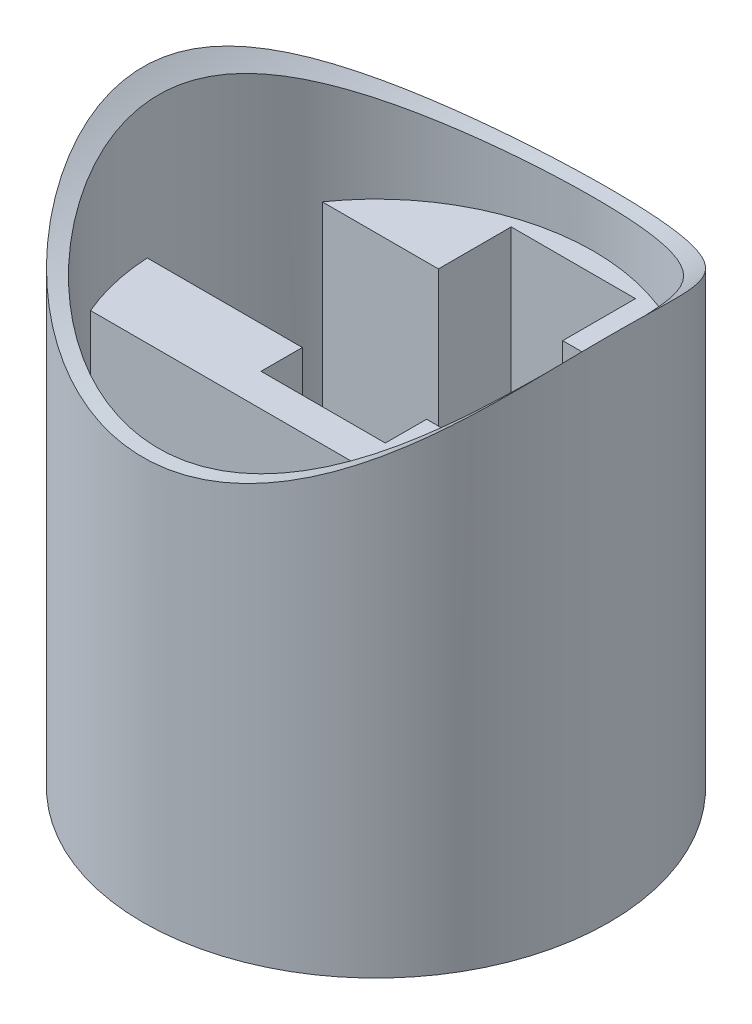
ISO-10303-21;
HEADER;
FILE_DESCRIPTION(('STEP AP214'),'2;1');
FILE_NAME('part.step','',(''),(''),'','','');
FILE_SCHEMA(('AUTOMOTIVE_DESIGN { 1 0 10303 214 1 1 1 1 }'));
ENDSEC;
DATA;
#1=APPLICATION_CONTEXT('core data for automotive mechanical design processes');
#2=APPLICATION_PROTOCOL_DEFINITION('international standard','automotive_design',2000,#1);
#3=PRODUCT_CONTEXT('',#1,'mechanical');
#4=PRODUCT('Part','Part','',(#3));
#5=PRODUCT_RELATED_PRODUCT_CATEGORY('part','',(#4));
#6=PRODUCT_DEFINITION_FORMATION('','',#4);
#7=PRODUCT_DEFINITION_CONTEXT('part definition',#1,'design');
#8=PRODUCT_DEFINITION('design','',#6,#7);
#9=PRODUCT_DEFINITION_SHAPE('','',#8);
#10=(LENGTH_UNIT() NAMED_UNIT(*) SI_UNIT(.MILLI.,.METRE.));
#11=(NAMED_UNIT(*) PLANE_ANGLE_UNIT() SI_UNIT($,.RADIAN.));
#12=(NAMED_UNIT(*) SI_UNIT($,.STERADIAN.) SOLID_ANGLE_UNIT());
#13=UNCERTAINTY_MEASURE_WITH_UNIT(LENGTH_MEASURE(1.E-05),#10,'distance_accuracy_value','');
#14=(GEOMETRIC_REPRESENTATION_CONTEXT(3) GLOBAL_UNCERTAINTY_ASSIGNED_CONTEXT((#13)) GLOBAL_UNIT_ASSIGNED_CONTEXT((#10,
#11,#12)) REPRESENTATION_CONTEXT('',''));
#15=CARTESIAN_POINT('',(0.,0.,0.));
#16=DIRECTION('',(0.,0.,1.));
#17=DIRECTION('',(1.,0.,0.));
#18=AXIS2_PLACEMENT_3D('',#15,#16,#17);
#19=CARTESIAN_POINT('',(0.,37.3,0.));
#20=DIRECTION('',(0.,-1.,0.));
#21=DIRECTION('',(0.,0.,-1.));
#22=AXIS2_PLACEMENT_3D('',#19,#20,#21);
#23=CYLINDRICAL_SURFACE('',#22,35.);
#24=CARTESIAN_POINT('',(0.,0.,0.));
#25=DIRECTION('',(0.,1.,0.));
#26=DIRECTION('',(0.,0.,1.));
#27=AXIS2_PLACEMENT_3D('',#24,#25,#26);
#28=CIRCLE('',#27,35.);
#29=CARTESIAN_POINT('',(-32.185295709608,0.,13.7516086362682));
#30=VERTEX_POINT('',#29);
#31=CARTESIAN_POINT('',(32.185295709608,0.,13.7516086362682));
#32=VERTEX_POINT('',#31);
#33=EDGE_CURVE('E147',#30,#32,#28,.T.);
#34=ORIENTED_EDGE('',*,*,#33,.F.);
#35=DIRECTION('',(0.,-1.,0.));
#36=VECTOR('',#35,1.);
#37=CARTESIAN_POINT('',(-32.185295709608,37.3,13.7516086362682));
#38=LINE('',#37,#36);
#39=CARTESIAN_POINT('',(-32.185295709608,37.3,13.7516086362682));
#40=VERTEX_POINT('',#39);
#41=EDGE_CURVE('E176',#40,#30,#38,.T.);
#42=ORIENTED_EDGE('',*,*,#41,.F.);
#43=CARTESIAN_POINT('',(0.,37.3,0.));
#44=DIRECTION('',(0.,1.,0.));
#45=DIRECTION('',(0.,0.,1.));
#46=AXIS2_PLACEMENT_3D('',#43,#44,#45);
#47=CIRCLE('',#46,35.);
#48=CARTESIAN_POINT('',(-34.9504647747409,37.3,1.86145427813728));
#49=VERTEX_POINT('',#48);
#50=EDGE_CURVE('E53',#49,#40,#47,.T.);
#51=ORIENTED_EDGE('',*,*,#50,.F.);
#52=DIRECTION('',(0.,-1.,0.));
#53=VECTOR('',#52,1.);
#54=CARTESIAN_POINT('',(-34.9504647747409,37.3,1.86145427813728));
#55=LINE('',#54,#53);
#56=CARTESIAN_POINT('',(-34.9504647747409,0.,1.86145427813728));
#57=VERTEX_POINT('',#56);
#58=EDGE_CURVE('E189',#49,#57,#55,.T.);
#59=ORIENTED_EDGE('',*,*,#58,.T.);
#60=CARTESIAN_POINT('',(-28.6937358472909,0.,-20.04169461712));
#61=VERTEX_POINT('',#60);
#62=EDGE_CURVE('E148',#61,#57,#28,.T.);
#63=ORIENTED_EDGE('',*,*,#62,.F.);
#64=DIRECTION('',(0.,-1.,0.));
#65=VECTOR('',#64,1.);
#66=CARTESIAN_POINT('',(-28.6937358472909,37.3,-20.04169461712));
#67=LINE('',#66,#65);
#68=CARTESIAN_POINT('',(-28.6937358472909,37.3,-20.04169461712));
#69=VERTEX_POINT('',#68);
#70=EDGE_CURVE('E186',#69,#61,#67,.T.);
#71=ORIENTED_EDGE('',*,*,#70,.F.);
#72=CARTESIAN_POINT('',(28.6937358472909,37.3,-20.04169461712));
#73=VERTEX_POINT('',#72);
#74=EDGE_CURVE('E11',#73,#69,#47,.T.);
#75=ORIENTED_EDGE('',*,*,#74,.F.);
#76=DIRECTION('',(0.,-1.,0.));
#77=VECTOR('',#76,1.);
#78=CARTESIAN_POINT('',(28.6937358472909,37.3,-20.04169461712));
#79=LINE('',#78,#77);
#80=CARTESIAN_POINT('',(28.6937358472909,0.,-20.04169461712));
#81=VERTEX_POINT('',#80);
#82=EDGE_CURVE('E143',#73,#81,#79,.T.);
#83=ORIENTED_EDGE('',*,*,#82,.T.);
#84=CARTESIAN_POINT('',(34.9504647747409,0.,1.86145427813728));
#85=VERTEX_POINT('',#84);
#86=EDGE_CURVE('E84',#85,#81,#28,.T.);
#87=ORIENTED_EDGE('',*,*,#86,.F.);
#88=DIRECTION('',(0.,-1.,0.));
#89=VECTOR('',#88,1.);
#90=CARTESIAN_POINT('',(34.9504647747409,37.3,1.86145427813728));
#91=LINE('',#90,#89);
#92=CARTESIAN_POINT('',(34.9504647747409,37.3,1.86145427813728));
#93=VERTEX_POINT('',#92);
#94=EDGE_CURVE('E177',#93,#85,#91,.T.);
#95=ORIENTED_EDGE('',*,*,#94,.F.);
#96=CARTESIAN_POINT('',(32.185295709608,37.3,13.7516086362682));
#97=VERTEX_POINT('',#96);
#98=EDGE_CURVE('E55',#97,#93,#47,.T.);
#99=ORIENTED_EDGE('',*,*,#98,.F.);
#100=DIRECTION('',(0.,-1.,0.));
#101=VECTOR('',#100,1.);
#102=CARTESIAN_POINT('',(32.185295709608,37.3,13.7516086362682));
#103=LINE('',#102,#101);
#104=EDGE_CURVE('E174',#97,#32,#103,.T.);
#105=ORIENTED_EDGE('',*,*,#104,.T.);
#106=EDGE_LOOP('',(#34,#42,#51,#59,#63,#71,#75,#83,#87,#95,#99,#105));
#107=FACE_BOUND('',#106,.T.);
#108=CARTESIAN_POINT('',(0.,44.8,-35.));
#109=CARTESIAN_POINT('',(-0.870232272500166,44.7999953172574,-35.0000050028505));
#110=CARTESIAN_POINT('',(-1.7404063049654,44.8227637162921,-34.9675030057698));
#111=CARTESIAN_POINT('',(-3.47352174425243,44.9132540161992,-34.8380480222201));
#112=CARTESIAN_POINT('',(-4.33646377261778,44.9809720129823,-34.741100633143));
#113=CARTESIAN_POINT('',(-6.04853863287652,45.15973116088,-34.4842684531884));
#114=CARTESIAN_POINT('',(-6.89766808169942,45.2707827639554,-34.3243684782164));
#115=CARTESIAN_POINT('',(-8.57578993154747,45.5336095547233,-33.9440143729934));
#116=CARTESIAN_POINT('',(-9.4047816345072,45.6853861519379,-33.7235581468396));
#117=CARTESIAN_POINT('',(-11.0332645970626,46.0254608125883,-33.2263207402555));
#118=CARTESIAN_POINT('',(-11.8328814909331,46.2135745196777,-32.949823548786));
#119=CARTESIAN_POINT('',(-13.4026192119663,46.6229535279744,-32.3431278646174));
#120=CARTESIAN_POINT('',(-14.1727403348015,46.8442184967565,-32.0129299104013));
#121=CARTESIAN_POINT('',(-15.6801115653812,47.315710078695,-31.3022123034325));
#122=CARTESIAN_POINT('',(-16.4173617516748,47.5659366226391,-30.9216927709379));
#123=CARTESIAN_POINT('',(-17.8564301108427,48.0909572365887,-30.1136018656613));
#124=CARTESIAN_POINT('',(-18.5582465238746,48.3657525249431,-29.6860281592486));
#125=CARTESIAN_POINT('',(-19.9848211152601,48.9605448495063,-28.7471572150268));
#126=CARTESIAN_POINT('',(-20.7061360797619,49.2823907504658,-28.2318011800753));
#127=CARTESIAN_POINT('',(-22.102634778417,49.9438899633164,-27.1523945586661));
#128=CARTESIAN_POINT('',(-22.7778163247959,50.2835441183761,-26.5883416657359));
#129=CARTESIAN_POINT('',(-24.0815274047952,50.9750618121491,-25.4135997093617));
#130=CARTESIAN_POINT('',(-24.7099908945907,51.3269416408213,-24.8028470108141));
#131=CARTESIAN_POINT('',(-25.917999123033,52.0361368766176,-23.5376807768098));
#132=CARTESIAN_POINT('',(-26.4975410370482,52.3934525961951,-22.883264724221));
#133=CARTESIAN_POINT('',(-27.7041565227637,53.1697139443232,-21.4134589202318));
#134=CARTESIAN_POINT('',(-28.3216161660374,53.5884269024707,-20.5900212446242));
#135=CARTESIAN_POINT('',(-29.4846248574707,54.4123175922997,-18.8870417012328));
#136=CARTESIAN_POINT('',(-30.030155249065,54.8174917921164,-18.0074853651762));
#137=CARTESIAN_POINT('',(-31.0449435416097,55.6002355170416,-16.1953260591599));
#138=CARTESIAN_POINT('',(-31.5142997158184,55.9778402580138,-15.2627935665584));
#139=CARTESIAN_POINT('',(-32.3725792269623,56.6905882066562,-13.3460634545392));
#140=CARTESIAN_POINT('',(-32.7615449259486,57.025753741565,-12.3618933903296));
#141=CARTESIAN_POINT('',(-33.3451470680861,57.5414149359981,-10.6601711031505));
#142=CARTESIAN_POINT('',(-33.5625682245631,57.7375609159975,-9.95511151138583));
#143=CARTESIAN_POINT('',(-33.9540987355543,58.0959176628177,-8.52459851568257));
#144=CARTESIAN_POINT('',(-34.1282150838378,58.2581339086503,-7.79914842592035));
#145=CARTESIAN_POINT('',(-34.4305317720713,58.5428397985108,-6.33231404014387));
#146=CARTESIAN_POINT('',(-34.5588090309209,58.6653959600004,-5.59095867114069));
#147=CARTESIAN_POINT('',(-34.7677456086353,58.8663806541385,-4.09556918006492));
#148=CARTESIAN_POINT('',(-34.8484050344508,58.9448092858987,-3.34153508647297));
#149=CARTESIAN_POINT('',(-34.9608969493595,59.0544829109754,-1.82193032229542));
#150=CARTESIAN_POINT('',(-34.9924426024632,59.0854507055495,-1.05631805359883));
#151=CARTESIAN_POINT('',(-35.0051496272315,59.0979050016435,0.475730381078191));
#152=CARTESIAN_POINT('',(-34.9863111850584,59.0793916859893,1.24216654400399));
#153=CARTESIAN_POINT('',(-34.8986208441605,58.9937163419341,2.76984985356926));
#154=CARTESIAN_POINT('',(-34.8297390970229,58.9265252796773,3.53109362955619));
#155=CARTESIAN_POINT('',(-34.6432842435913,58.7464351025755,5.0420637772475));
#156=CARTESIAN_POINT('',(-34.5257101254215,58.6335350378534,5.79178990926803));
#157=CARTESIAN_POINT('',(-34.2532963381461,58.3754981601892,7.22553544524251));
#158=CARTESIAN_POINT('',(-34.1014533690274,58.2330031116955,7.91060977052729));
#159=CARTESIAN_POINT('',(-33.7589888057992,57.9166028261327,9.26380107661202));
#160=CARTESIAN_POINT('',(-33.5683529619254,57.7426860495786,9.93191172442692));
#161=CARTESIAN_POINT('',(-33.1501750145558,57.3681333630529,11.2491653221722));
#162=CARTESIAN_POINT('',(-32.9226130438115,57.1674830801928,11.8982978382344));
#163=CARTESIAN_POINT('',(-32.4325419821708,56.7443163101299,13.1756669761685));
#164=CARTESIAN_POINT('',(-32.1700382646967,56.5218031864199,13.8039067924386));
#165=CARTESIAN_POINT('',(-31.4634650949709,55.9366778949229,15.3663950836281));
#166=CARTESIAN_POINT('',(-30.996945831479,55.5623594887798,16.2861965724637));
#167=CARTESIAN_POINT('',(-29.990231448705,54.7876297370643,18.0731428843509));
#168=CARTESIAN_POINT('',(-29.4500062373211,54.3872077691783,18.9402659902055));
#169=CARTESIAN_POINT('',(-28.2982946846362,53.5725218843927,20.6215052468992));
#170=CARTESIAN_POINT('',(-27.6866822177674,53.1582344198714,21.4355234948486));
#171=CARTESIAN_POINT('',(-26.395557161849,52.3280842687203,23.0067017387662));
#172=CARTESIAN_POINT('',(-25.716053266374,51.9122217903174,23.7638689928764));
#173=CARTESIAN_POINT('',(-24.282503247462,51.0844038840303,25.227400571408));
#174=CARTESIAN_POINT('',(-23.5276600959749,50.6725553131809,25.9330457904297));
#175=CARTESIAN_POINT('',(-21.9523703939848,49.8681002773168,27.2794229232896));
#176=CARTESIAN_POINT('',(-21.1319177462958,49.4754956061469,27.9201487915053));
#177=CARTESIAN_POINT('',(-19.4296026042396,48.7201113400548,29.1303820613389));
#178=CARTESIAN_POINT('',(-18.5478533739427,48.3572793019831,29.7000156531339));
#179=CARTESIAN_POINT('',(-16.7254223448341,47.6703101246462,30.7631633942938));
#180=CARTESIAN_POINT('',(-15.7847582476006,47.3461614468069,31.2567002548817));
#181=CARTESIAN_POINT('',(-14.0638566010933,46.8121805002745,32.0608786010831));
#182=CARTESIAN_POINT('',(-13.294127782226,46.5929183226784,32.3878323646545));
#183=CARTESIAN_POINT('',(-11.7255644343501,46.1875846662284,32.98811888247));
#184=CARTESIAN_POINT('',(-10.9267338992557,46.001508653422,33.2614589620204));
#185=CARTESIAN_POINT('',(-9.30461607908543,45.6664103993224,33.7511702836791));
#186=CARTESIAN_POINT('',(-8.4813412531449,45.5173696323341,33.9675700115775));
#187=CARTESIAN_POINT('',(-6.81512211938829,45.2594640133613,34.3406887006037));
#188=CARTESIAN_POINT('',(-5.97217741167641,45.1505999789422,34.4974064472516));
#189=CARTESIAN_POINT('',(-4.26917518982882,44.9752088530217,34.7493603279024));
#190=CARTESIAN_POINT('',(-3.40906158295147,44.9088575977143,34.8443411361966));
#191=CARTESIAN_POINT('',(-1.68186449744328,44.8208141178331,34.9702882164267));
#192=CARTESIAN_POINT('',(-0.814781019939594,44.7991218860375,35.0012544987146));
#193=CARTESIAN_POINT('',(0.919213573146765,44.800932644772,34.9986676001079));
#194=CARTESIAN_POINT('',(1.78612469288872,44.8244343651223,34.9651162324871));
#195=CARTESIAN_POINT('',(3.51268174307029,44.9160510638679,34.8340431489635));
#196=CARTESIAN_POINT('',(4.37232793341643,44.9841644393562,34.736523731447));
#197=CARTESIAN_POINT('',(6.02181468542681,45.1574779045319,34.4874963238937));
#198=CARTESIAN_POINT('',(6.81254374887127,45.2599612538386,34.3399362019104));
#199=CARTESIAN_POINT('',(8.37678839379366,45.5003494049773,33.9922245209992));
#200=CARTESIAN_POINT('',(9.1503048800013,45.6382523402788,33.7920757333598));
#201=CARTESIAN_POINT('',(10.6758813786184,45.9468389033205,33.3415398294173));
#202=CARTESIAN_POINT('',(11.4279395926792,46.1175252693207,33.0911485164926));
#203=CARTESIAN_POINT('',(12.9069400369755,46.488590215088,32.5427880820563));
#204=CARTESIAN_POINT('',(13.6338808721898,46.6889704407961,32.244816323073));
#205=CARTESIAN_POINT('',(15.1100577321844,47.131132126945,31.5814246835964));
#206=CARTESIAN_POINT('',(15.8572430318164,47.374837980671,31.2127277125839));
#207=CARTESIAN_POINT('',(17.3166332086913,47.8880328750213,30.4273074528046));
#208=CARTESIAN_POINT('',(18.0288368025108,48.1575228605569,30.0105824038381));
#209=CARTESIAN_POINT('',(19.4164933103296,48.7178997452128,29.1320185952275));
#210=CARTESIAN_POINT('',(20.0919284960775,49.0087968097489,28.6701583679987));
#211=CARTESIAN_POINT('',(21.4041263423369,49.6072626685292,27.7042811667664));
#212=CARTESIAN_POINT('',(22.0408868977116,49.9148323685765,27.2002619015062));
#213=CARTESIAN_POINT('',(23.3800396878468,50.5955870084453,26.0628453173255));
#214=CARTESIAN_POINT('',(24.0750385491608,50.9709993214023,25.4220614956052));
#215=CARTESIAN_POINT('',(25.4087931103085,51.7304943373356,24.0890524522557));
#216=CARTESIAN_POINT('',(26.0475407061654,52.11457827963,23.3968198449338));
#217=CARTESIAN_POINT('',(27.267628446132,52.883455203745,21.9627738354058));
#218=CARTESIAN_POINT('',(27.8489237337366,53.268248504346,21.2209224387395));
#219=CARTESIAN_POINT('',(28.9516393742928,54.0292847605453,19.6899077976574));
#220=CARTESIAN_POINT('',(29.4730665085803,54.4055286806619,18.9007499271453));
#221=CARTESIAN_POINT('',(30.4067125742577,55.1044253033261,17.3541850110502));
#222=CARTESIAN_POINT('',(30.8246071200569,55.4287611045638,16.6009653168964));
#223=CARTESIAN_POINT('',(31.6071001429939,56.0541349533813,15.0578711781996));
#224=CARTESIAN_POINT('',(31.971697235848,56.355172395742,14.2679957823074));
#225=CARTESIAN_POINT('',(32.6439561302433,56.9243366447996,12.6544361680078));
#226=CARTESIAN_POINT('',(32.9517078185012,57.1925151795294,11.8308078857448));
#227=CARTESIAN_POINT('',(33.5072229275964,57.6866006983595,10.1512421641427));
#228=CARTESIAN_POINT('',(33.7550024839275,57.9125190488327,9.29531348701855));
#229=CARTESIAN_POINT('',(34.1428567677205,58.2716499483796,7.73153309223871));
#230=CARTESIAN_POINT('',(34.2945793427502,58.4143710387409,7.02874420606836));
#231=CARTESIAN_POINT('',(34.5552281784688,58.6618121539788,5.60866076307217));
#232=CARTESIAN_POINT('',(34.6641599386505,58.7665370620079,4.89136808274731));
#233=CARTESIAN_POINT('',(34.8373963630593,58.9339937365367,3.44731721016306));
#234=CARTESIAN_POINT('',(34.9017502116632,58.9967717817674,2.7205703542331));
#235=CARTESIAN_POINT('',(34.9848682116883,59.0779839637119,1.26196217526727));
#236=CARTESIAN_POINT('',(35.0036319102858,59.0964176599759,0.530100801503916));
#237=CARTESIAN_POINT('',(34.9952029943901,59.0881560514529,-0.933973005964386));
#238=CARTESIAN_POINT('',(34.9679555000256,59.0614068547386,-1.66618481603511));
#239=CARTESIAN_POINT('',(34.8679201881697,58.9638038185339,-3.12447973736782));
#240=CARTESIAN_POINT('',(34.7951326480787,58.8929502476987,-3.85056288593433));
#241=CARTESIAN_POINT('',(34.6051877008243,58.7098585900908,-5.2924965828901));
#242=CARTESIAN_POINT('',(34.4879747643385,58.5975687148525,-6.00833315673878));
#243=CARTESIAN_POINT('',(34.2110182676687,58.3357377014746,-7.42477357457712));
#244=CARTESIAN_POINT('',(34.0512690499649,58.1861916082581,-8.12537537885523));
#245=CARTESIAN_POINT('',(33.6404354364489,57.8078445470819,-9.7036406614853));
#246=CARTESIAN_POINT('',(33.376297853919,57.5685887166693,-10.5754147197585));
#247=CARTESIAN_POINT('',(32.7858092176535,57.0475757737317,-12.2844975336967));
#248=CARTESIAN_POINT('',(32.4594391994652,56.765805711074,-13.1217956884992));
#249=CARTESIAN_POINT('',(31.7479704509998,56.1699356926838,-14.7602513516134));
#250=CARTESIAN_POINT('',(31.3628028013533,55.8557979396252,-15.5613649994883));
#251=CARTESIAN_POINT('',(30.5371993348437,55.20510520001,-17.1248665902838));
#252=CARTESIAN_POINT('',(30.0967667568063,54.8685515276902,-17.8872567989337));
#253=CARTESIAN_POINT('',(29.1519412024148,54.1734520083068,-19.3899619692432));
#254=CARTESIAN_POINT('',(28.6462778984177,53.814573726319,-20.129323014711));
#255=CARTESIAN_POINT('',(27.5815143441779,53.0905934269993,-21.5652255441576));
#256=CARTESIAN_POINT('',(27.0224143598532,52.725491440646,-22.2617672411906));
#257=CARTESIAN_POINT('',(25.8521175062051,51.9964555657974,-23.6107068578307));
#258=CARTESIAN_POINT('',(25.2409057126123,51.632522043112,-24.2630920348705));
#259=CARTESIAN_POINT('',(23.9678165846028,50.9128879002986,-25.5214602870096));
#260=CARTESIAN_POINT('',(23.3059338423423,50.55718816421,-26.1274383954825));
#261=CARTESIAN_POINT('',(21.8062903640518,49.796482813713,-27.3974591605009));
#262=CARTESIAN_POINT('',(20.9585928958463,49.3944668880692,-28.0516304885995));
#263=CARTESIAN_POINT('',(19.1968024658869,48.6219962542282,-29.2854798616255));
#264=CARTESIAN_POINT('',(18.2826994982445,48.2515463207004,-29.8651466437189));
#265=CARTESIAN_POINT('',(16.3931041007643,47.5529919248331,-30.9426542203358));
#266=CARTESIAN_POINT('',(15.4176640448714,47.2248520464071,-31.4405635475673));
#267=CARTESIAN_POINT('',(13.4109161011486,46.6207069740914,-32.3474679886086));
#268=CARTESIAN_POINT('',(12.3796240931735,46.3446870605277,-32.7564882113394));
#269=CARTESIAN_POINT('',(10.4286834386278,45.8910097063735,-33.4236386751555));
#270=CARTESIAN_POINT('',(9.51560891229527,45.7047992969145,-33.6952158786324));
#271=CARTESIAN_POINT('',(7.66208842358354,45.3816142576465,-34.1643944527418));
#272=CARTESIAN_POINT('',(6.72164532429602,45.2446344975737,-34.3620035315884));
#273=CARTESIAN_POINT('',(4.82256952364146,45.0239449721178,-34.679513721252));
#274=CARTESIAN_POINT('',(3.86395723969587,44.9401786851245,-34.7994972858562));
#275=CARTESIAN_POINT('',(1.93687202737273,44.828211191236,-34.9597342169896));
#276=CARTESIAN_POINT('',(0.968399953266366,44.8000052109855,-34.9999944327965));
#277=CARTESIAN_POINT('',(0.,44.8,-35.));
#278=B_SPLINE_CURVE_WITH_KNOTS('',3,(#108,#109,#110,#111,#112,#113,#114,#115,#116,#117,#118,
#119,#120,#121,#122,#123,#124,#125,#126,#127,#128,#129,#130,#131,#132,#133,#134,#135,#136,#137,
#138,#139,#140,#141,#142,#143,#144,#145,#146,#147,#148,#149,#150,#151,#152,#153,#154,#155,#156,
#157,#158,#159,#160,#161,#162,#163,#164,#165,#166,#167,#168,#169,#170,#171,#172,#173,#174,#175,
#176,#177,#178,#179,#180,#181,#182,#183,#184,#185,#186,#187,#188,#189,#190,#191,#192,#193,#194,
#195,#196,#197,#198,#199,#200,#201,#202,#203,#204,#205,#206,#207,#208,#209,#210,#211,#212,#213,
#214,#215,#216,#217,#218,#219,#220,#221,#222,#223,#224,#225,#226,#227,#228,#229,#230,#231,#232,
#233,#234,#235,#236,#237,#238,#239,#240,#241,#242,#243,#244,#245,#246,#247,#248,#249,#250,#251,
#252,#253,#254,#255,#256,#257,#258,#259,#260,#261,#262,#263,#264,#265,#266,#267,#268,#269,#270,
#271,#272,#273,#274,#275,#276,#277),.UNSPECIFIED.,.T.,.F.,(4,2,2,2,2,2,2,2,2,2,2,2,2,2,2,2,2,2,
2,2,2,2,2,2,2,2,2,2,2,2,2,2,2,2,2,2,2,2,2,2,2,2,2,2,2,2,2,2,2,2,2,2,2,2,2,2,2,2,2,2,2,2,2,2,2,2,
2,2,2,2,2,2,2,2,2,2,2,2,2,2,2,2,2,2,4),(0.,2.60970041242935,5.2191741894438,7.82927775464036,
10.4394716690991,13.0367549963016,15.6340122809168,18.2312633587348,20.8286433041476,
23.6552943811587,26.4820794128799,29.3127874434289,32.1436588016303,35.47326272235,
38.803728563403,42.1298629761254,45.4542401761895,47.7426149751837,50.030619959053,
52.3147673941782,54.59890969903,56.8963425492365,59.1937669107537,61.4925627010305,
63.7914062649553,65.9374376273276,68.0842587177853,70.2322387089391,72.3798887595906,
75.6667414125245,78.9549400347365,82.249038718415,85.5427161283008,88.8759385885215,
92.2094711707444,95.5369998683626,98.8635335279534,101.454642483074,104.045397164675,
106.634853283619,109.224362093085,111.82451332951,114.424664145457,117.024741885018,
119.624726208319,122.054675091661,124.484495948574,126.914519846365,129.344678491647,
131.946449602283,134.548316096579,137.151426192637,139.754677854394,142.803032078113,
145.851824754479,148.902979309721,151.953787915438,154.712674780363,157.471633288557,
160.226191135678,162.980007043503,165.176869514131,167.373449550661,169.567602146323,
171.76177653529,173.958569875721,176.155349834842,178.354884753334,180.554712366281,
183.375960512683,186.198069772449,189.023512720799,191.848790160066,194.741148226189,
197.63349189977,200.526666710346,203.420150725867,206.846723074748,210.273812810016,
213.698014977828,217.121248634375,220.028985687107,222.936419640313,225.840760225923,
228.744851279884),.UNSPECIFIED.);
#279=CARTESIAN_POINT('',(0.,44.8,-35.));
#280=VERTEX_POINT('',#279);
#281=EDGE_CURVE('E42',#280,#280,#278,.T.);
#282=ORIENTED_EDGE('',*,*,#281,.T.);
#283=EDGE_LOOP('',(#282));
#284=FACE_BOUND('',#283,.T.);
#285=ADVANCED_FACE('F38',(#107,#284),#23,.F.);
#286=CARTESIAN_POINT('',(10.,37.3,0.));
#287=DIRECTION('',(1.,0.,0.));
#288=DIRECTION('',(0.,0.,-1.));
#289=AXIS2_PLACEMENT_3D('',#286,#287,#288);
#290=PLANE('',#289);
#291=DIRECTION('',(0.,0.,1.));
#292=VECTOR('',#291,1.);
#293=CARTESIAN_POINT('',(10.,0.,0.));
#294=LINE('',#293,#292);
#295=CARTESIAN_POINT('',(9.99999999999999,0.,-31.75));
#296=VERTEX_POINT('',#295);
#297=CARTESIAN_POINT('',(10.,0.,-20.04169461712));
#298=VERTEX_POINT('',#297);
#299=EDGE_CURVE('E166',#296,#298,#294,.T.);
#300=ORIENTED_EDGE('',*,*,#299,.T.);
#301=DIRECTION('',(0.,-1.,0.));
#302=VECTOR('',#301,1.);
#303=CARTESIAN_POINT('',(10.,37.3,-20.04169461712));
#304=LINE('',#303,#302);
#305=CARTESIAN_POINT('',(10.,37.3,-20.04169461712));
#306=VERTEX_POINT('',#305);
#307=EDGE_CURVE('E131',#306,#298,#304,.T.);
#308=ORIENTED_EDGE('',*,*,#307,.F.);
#309=DIRECTION('',(0.,0.,1.));
#310=VECTOR('',#309,1.);
#311=CARTESIAN_POINT('',(10.,37.3,0.));
#312=LINE('',#311,#310);
#313=CARTESIAN_POINT('',(9.99999999999999,37.3,-31.75));
#314=VERTEX_POINT('',#313);
#315=EDGE_CURVE('E115',#314,#306,#312,.T.);
#316=ORIENTED_EDGE('',*,*,#315,.F.);
#317=DIRECTION('',(0.,-1.,0.));
#318=VECTOR('',#317,1.);
#319=CARTESIAN_POINT('',(9.99999999999999,37.3,-31.75));
#320=LINE('',#319,#318);
#321=EDGE_CURVE('E124',#314,#296,#320,.T.);
#322=ORIENTED_EDGE('',*,*,#321,.T.);
#323=EDGE_LOOP('',(#300,#308,#316,#322));
#324=FACE_BOUND('',#323,.T.);
#325=ADVANCED_FACE('F133',(#324),#290,.F.);
#326=CARTESIAN_POINT('',(0.,37.3,-31.75));
#327=DIRECTION('',(0.,0.,-1.));
#328=DIRECTION('',(-1.,0.,0.));
#329=AXIS2_PLACEMENT_3D('',#326,#327,#328);
#330=PLANE('',#329);
#331=DIRECTION('',(1.,0.,0.));
#332=VECTOR('',#331,1.);
#333=CARTESIAN_POINT('',(0.,0.,-31.75));
#334=LINE('',#333,#332);
#335=CARTESIAN_POINT('',(-10.,0.,-31.75));
#336=VERTEX_POINT('',#335);
#337=EDGE_CURVE('E127',#336,#296,#334,.T.);
#338=ORIENTED_EDGE('',*,*,#337,.T.);
#339=ORIENTED_EDGE('',*,*,#321,.F.);
#340=DIRECTION('',(1.,0.,0.));
#341=VECTOR('',#340,1.);
#342=CARTESIAN_POINT('',(0.,37.3,-31.75));
#343=LINE('',#342,#341);
#344=CARTESIAN_POINT('',(-10.,37.3,-31.75));
#345=VERTEX_POINT('',#344);
#346=EDGE_CURVE('E110',#345,#314,#343,.T.);
#347=ORIENTED_EDGE('',*,*,#346,.F.);
#348=DIRECTION('',(0.,-1.,0.));
#349=VECTOR('',#348,1.);
#350=CARTESIAN_POINT('',(-10.,37.3,-31.75));
#351=LINE('',#350,#349);
#352=EDGE_CURVE('E130',#345,#336,#351,.T.);
#353=ORIENTED_EDGE('',*,*,#352,.T.);
#354=EDGE_LOOP('',(#338,#339,#347,#353));
#355=FACE_BOUND('',#354,.T.);
#356=ADVANCED_FACE('F125',(#355),#330,.F.);
#357=CARTESIAN_POINT('',(-10.,37.3,0.));
#358=DIRECTION('',(1.,0.,0.));
#359=DIRECTION('',(0.,0.,-1.));
#360=AXIS2_PLACEMENT_3D('',#357,#358,#359);
#361=PLANE('',#360);
#362=DIRECTION('',(0.,0.,1.));
#363=VECTOR('',#362,1.);
#364=CARTESIAN_POINT('',(-10.,0.,0.));
#365=LINE('',#364,#363);
#366=CARTESIAN_POINT('',(-10.,0.,-20.04169461712));
#367=VERTEX_POINT('',#366);
#368=EDGE_CURVE('E162',#336,#367,#365,.T.);
#369=ORIENTED_EDGE('',*,*,#368,.F.);
#370=ORIENTED_EDGE('',*,*,#352,.F.);
#371=DIRECTION('',(0.,0.,1.));
#372=VECTOR('',#371,1.);
#373=CARTESIAN_POINT('',(-10.,37.3,0.));
#374=LINE('',#373,#372);
#375=CARTESIAN_POINT('',(-10.,37.3,-20.04169461712));
#376=VERTEX_POINT('',#375);
#377=EDGE_CURVE('E118',#345,#376,#374,.T.);
#378=ORIENTED_EDGE('',*,*,#377,.T.);
#379=DIRECTION('',(0.,-1.,0.));
#380=VECTOR('',#379,1.);
#381=CARTESIAN_POINT('',(-10.,37.3,-20.04169461712));
#382=LINE('',#381,#380);
#383=EDGE_CURVE('E183',#376,#367,#382,.T.);
#384=ORIENTED_EDGE('',*,*,#383,.T.);
#385=EDGE_LOOP('',(#369,#370,#378,#384));
#386=FACE_BOUND('',#385,.T.);
#387=ADVANCED_FACE('F298',(#386),#361,.T.);
#388=CARTESIAN_POINT('',(0.,37.3,-20.04169461712));
#389=DIRECTION('',(0.,0.,1.));
#390=DIRECTION('',(1.,0.,0.));
#391=AXIS2_PLACEMENT_3D('',#388,#389,#390);
#392=PLANE('',#391);
#393=DIRECTION('',(-1.,0.,0.));
#394=VECTOR('',#393,1.);
#395=CARTESIAN_POINT('',(0.,0.,-20.04169461712));
#396=LINE('',#395,#394);
#397=EDGE_CURVE('E168',#81,#298,#396,.T.);
#398=ORIENTED_EDGE('',*,*,#397,.F.);
#399=ORIENTED_EDGE('',*,*,#82,.F.);
#400=DIRECTION('',(-1.,0.,0.));
#401=VECTOR('',#400,1.);
#402=CARTESIAN_POINT('',(0.,37.3,-20.04169461712));
#403=LINE('',#402,#401);
#404=EDGE_CURVE('E136',#73,#306,#403,.T.);
#405=ORIENTED_EDGE('',*,*,#404,.T.);
#406=ORIENTED_EDGE('',*,*,#307,.T.);
#407=EDGE_LOOP('',(#398,#399,#405,#406));
#408=FACE_BOUND('',#407,.T.);
#409=ADVANCED_FACE('F220',(#408),#392,.T.);
#410=CARTESIAN_POINT('',(0.,37.3,0.));
#411=DIRECTION('',(0.,1.,0.));
#412=DIRECTION('',(0.,0.,1.));
#413=AXIS2_PLACEMENT_3D('',#410,#411,#412);
#414=PLANE('',#413);
#415=ORIENTED_EDGE('',*,*,#404,.F.);
#416=ORIENTED_EDGE('',*,*,#74,.T.);
#417=DIRECTION('',(1.,0.,0.));
#418=VECTOR('',#417,1.);
#419=CARTESIAN_POINT('',(0.,37.3,-20.04169461712));
#420=LINE('',#419,#418);
#421=EDGE_CURVE('E295',#69,#376,#420,.T.);
#422=ORIENTED_EDGE('',*,*,#421,.T.);
#423=ORIENTED_EDGE('',*,*,#377,.F.);
#424=ORIENTED_EDGE('',*,*,#346,.T.);
#425=ORIENTED_EDGE('',*,*,#315,.T.);
#426=EDGE_LOOP('',(#415,#416,#422,#423,#424,#425));
#427=FACE_BOUND('',#426,.T.);
#428=ADVANCED_FACE('F113',(#427),#414,.T.);
#429=CARTESIAN_POINT('',(0.,37.3,-20.04169461712));
#430=DIRECTION('',(0.,0.,-1.));
#431=DIRECTION('',(-1.,0.,0.));
#432=AXIS2_PLACEMENT_3D('',#429,#430,#431);
#433=PLANE('',#432);
#434=DIRECTION('',(1.,0.,0.));
#435=VECTOR('',#434,1.);
#436=CARTESIAN_POINT('',(0.,0.,-20.04169461712));
#437=LINE('',#436,#435);
#438=EDGE_CURVE('E159',#61,#367,#437,.T.);
#439=ORIENTED_EDGE('',*,*,#438,.T.);
#440=ORIENTED_EDGE('',*,*,#383,.F.);
#441=ORIENTED_EDGE('',*,*,#421,.F.);
#442=ORIENTED_EDGE('',*,*,#70,.T.);
#443=EDGE_LOOP('',(#439,#440,#441,#442));
#444=FACE_BOUND('',#443,.T.);
#445=ADVANCED_FACE('F302',(#444),#433,.F.);
#446=CARTESIAN_POINT('',(0.,0.,0.));
#447=DIRECTION('',(0.,-1.,0.));
#448=DIRECTION('',(0.,0.,-1.));
#449=AXIS2_PLACEMENT_3D('',#446,#447,#448);
#450=PLANE('',#449);
#451=DIRECTION('',(-1.,0.,0.));
#452=VECTOR('',#451,1.);
#453=CARTESIAN_POINT('',(0.,0.,1.86145427813728));
#454=LINE('',#453,#452);
#455=CARTESIAN_POINT('',(10.,0.,1.86145427813728));
#456=VERTEX_POINT('',#455);
#457=EDGE_CURVE('E145',#85,#456,#454,.T.);
#458=ORIENTED_EDGE('',*,*,#457,.F.);
#459=ORIENTED_EDGE('',*,*,#86,.T.);
#460=ORIENTED_EDGE('',*,*,#397,.T.);
#461=ORIENTED_EDGE('',*,*,#299,.F.);
#462=ORIENTED_EDGE('',*,*,#337,.F.);
#463=ORIENTED_EDGE('',*,*,#368,.T.);
#464=ORIENTED_EDGE('',*,*,#438,.F.);
#465=ORIENTED_EDGE('',*,*,#62,.T.);
#466=DIRECTION('',(1.,0.,0.));
#467=VECTOR('',#466,1.);
#468=CARTESIAN_POINT('',(0.,0.,1.86145427813728));
#469=LINE('',#468,#467);
#470=CARTESIAN_POINT('',(-10.,0.,1.86145427813728));
#471=VERTEX_POINT('',#470);
#472=EDGE_CURVE('E156',#57,#471,#469,.T.);
#473=ORIENTED_EDGE('',*,*,#472,.T.);
#474=DIRECTION('',(0.,0.,1.));
#475=VECTOR('',#474,1.);
#476=CARTESIAN_POINT('',(-10.,0.,0.));
#477=LINE('',#476,#475);
#478=CARTESIAN_POINT('',(-10.,0.,8.5));
#479=VERTEX_POINT('',#478);
#480=EDGE_CURVE('E153',#471,#479,#477,.T.);
#481=ORIENTED_EDGE('',*,*,#480,.T.);
#482=DIRECTION('',(1.,0.,0.));
#483=VECTOR('',#482,1.);
#484=CARTESIAN_POINT('',(0.,0.,8.5));
#485=LINE('',#484,#483);
#486=CARTESIAN_POINT('',(10.,0.,8.5));
#487=VERTEX_POINT('',#486);
#488=EDGE_CURVE('E151',#479,#487,#485,.T.);
#489=ORIENTED_EDGE('',*,*,#488,.T.);
#490=DIRECTION('',(0.,0.,1.));
#491=VECTOR('',#490,1.);
#492=CARTESIAN_POINT('',(10.,0.,0.));
#493=LINE('',#492,#491);
#494=EDGE_CURVE('E75',#456,#487,#493,.T.);
#495=ORIENTED_EDGE('',*,*,#494,.F.);
#496=EDGE_LOOP('',(#458,#459,#460,#461,#462,#463,#464,#465,#473,#481,#489,#495));
#497=FACE_BOUND('',#496,.T.);
#498=ADVANCED_FACE('F222',(#497),#450,.F.);
#499=CARTESIAN_POINT('',(0.,37.3,1.86145427813728));
#500=DIRECTION('',(0.,0.,-1.));
#501=DIRECTION('',(-1.,0.,0.));
#502=AXIS2_PLACEMENT_3D('',#499,#500,#501);
#503=PLANE('',#502);
#504=ORIENTED_EDGE('',*,*,#472,.F.);
#505=ORIENTED_EDGE('',*,*,#58,.F.);
#506=DIRECTION('',(1.,0.,0.));
#507=VECTOR('',#506,1.);
#508=CARTESIAN_POINT('',(0.,37.3,1.86145427813728));
#509=LINE('',#508,#507);
#510=CARTESIAN_POINT('',(-10.,37.3,1.86145427813728));
#511=VERTEX_POINT('',#510);
#512=EDGE_CURVE('E263',#49,#511,#509,.T.);
#513=ORIENTED_EDGE('',*,*,#512,.T.);
#514=DIRECTION('',(0.,-1.,0.));
#515=VECTOR('',#514,1.);
#516=CARTESIAN_POINT('',(-10.,37.3,1.86145427813728));
#517=LINE('',#516,#515);
#518=EDGE_CURVE('E192',#511,#471,#517,.T.);
#519=ORIENTED_EDGE('',*,*,#518,.T.);
#520=EDGE_LOOP('',(#504,#505,#513,#519));
#521=FACE_BOUND('',#520,.T.);
#522=ADVANCED_FACE('F272',(#521),#503,.T.);
#523=CARTESIAN_POINT('',(-10.,37.3,0.));
#524=DIRECTION('',(1.,0.,0.));
#525=DIRECTION('',(0.,0.,-1.));
#526=AXIS2_PLACEMENT_3D('',#523,#524,#525);
#527=PLANE('',#526);
#528=ORIENTED_EDGE('',*,*,#480,.F.);
#529=ORIENTED_EDGE('',*,*,#518,.F.);
#530=DIRECTION('',(0.,0.,1.));
#531=VECTOR('',#530,1.);
#532=CARTESIAN_POINT('',(-10.,37.3,0.));
#533=LINE('',#532,#531);
#534=CARTESIAN_POINT('',(-10.,37.3,8.5));
#535=VERTEX_POINT('',#534);
#536=EDGE_CURVE('E289',#511,#535,#533,.T.);
#537=ORIENTED_EDGE('',*,*,#536,.T.);
#538=DIRECTION('',(0.,-1.,0.));
#539=VECTOR('',#538,1.);
#540=CARTESIAN_POINT('',(-10.,37.3,8.5));
#541=LINE('',#540,#539);
#542=EDGE_CURVE('E195',#535,#479,#541,.T.);
#543=ORIENTED_EDGE('',*,*,#542,.T.);
#544=EDGE_LOOP('',(#528,#529,#537,#543));
#545=FACE_BOUND('',#544,.T.);
#546=ADVANCED_FACE('F276',(#545),#527,.T.);
#547=CARTESIAN_POINT('',(0.,37.3,8.5));
#548=DIRECTION('',(0.,0.,-1.));
#549=DIRECTION('',(-1.,0.,0.));
#550=AXIS2_PLACEMENT_3D('',#547,#548,#549);
#551=PLANE('',#550);
#552=ORIENTED_EDGE('',*,*,#488,.F.);
#553=ORIENTED_EDGE('',*,*,#542,.F.);
#554=DIRECTION('',(1.,0.,0.));
#555=VECTOR('',#554,1.);
#556=CARTESIAN_POINT('',(0.,37.3,8.5));
#557=LINE('',#556,#555);
#558=CARTESIAN_POINT('',(10.,37.3,8.5));
#559=VERTEX_POINT('',#558);
#560=EDGE_CURVE('E283',#535,#559,#557,.T.);
#561=ORIENTED_EDGE('',*,*,#560,.T.);
#562=DIRECTION('',(0.,-1.,0.));
#563=VECTOR('',#562,1.);
#564=CARTESIAN_POINT('',(10.,37.3,8.5));
#565=LINE('',#564,#563);
#566=EDGE_CURVE('E198',#559,#487,#565,.T.);
#567=ORIENTED_EDGE('',*,*,#566,.T.);
#568=EDGE_LOOP('',(#552,#553,#561,#567));
#569=FACE_BOUND('',#568,.T.);
#570=ADVANCED_FACE('F281',(#569),#551,.T.);
#571=CARTESIAN_POINT('',(10.,37.3,0.));
#572=DIRECTION('',(1.,0.,0.));
#573=DIRECTION('',(0.,0.,-1.));
#574=AXIS2_PLACEMENT_3D('',#571,#572,#573);
#575=PLANE('',#574);
#576=ORIENTED_EDGE('',*,*,#494,.T.);
#577=ORIENTED_EDGE('',*,*,#566,.F.);
#578=DIRECTION('',(0.,0.,1.));
#579=VECTOR('',#578,1.);
#580=CARTESIAN_POINT('',(10.,37.3,0.));
#581=LINE('',#580,#579);
#582=CARTESIAN_POINT('',(10.,37.3,1.86145427813728));
#583=VERTEX_POINT('',#582);
#584=EDGE_CURVE('E287',#583,#559,#581,.T.);
#585=ORIENTED_EDGE('',*,*,#584,.F.);
#586=DIRECTION('',(0.,-1.,0.));
#587=VECTOR('',#586,1.);
#588=CARTESIAN_POINT('',(10.,37.3,1.86145427813728));
#589=LINE('',#588,#587);
#590=EDGE_CURVE('E201',#583,#456,#589,.T.);
#591=ORIENTED_EDGE('',*,*,#590,.T.);
#592=EDGE_LOOP('',(#576,#577,#585,#591));
#593=FACE_BOUND('',#592,.T.);
#594=ADVANCED_FACE('F286',(#593),#575,.F.);
#595=CARTESIAN_POINT('',(0.,37.3,1.86145427813728));
#596=DIRECTION('',(0.,0.,1.));
#597=DIRECTION('',(1.,0.,0.));
#598=AXIS2_PLACEMENT_3D('',#595,#596,#597);
#599=PLANE('',#598);
#600=ORIENTED_EDGE('',*,*,#457,.T.);
#601=ORIENTED_EDGE('',*,*,#590,.F.);
#602=DIRECTION('',(-1.,0.,0.));
#603=VECTOR('',#602,1.);
#604=CARTESIAN_POINT('',(0.,37.3,1.86145427813728));
#605=LINE('',#604,#603);
#606=EDGE_CURVE('E173',#93,#583,#605,.T.);
#607=ORIENTED_EDGE('',*,*,#606,.F.);
#608=ORIENTED_EDGE('',*,*,#94,.T.);
#609=EDGE_LOOP('',(#600,#601,#607,#608));
#610=FACE_BOUND('',#609,.T.);
#611=ADVANCED_FACE('F40',(#610),#599,.F.);
#612=DIRECTION('',(1.,0.,0.));
#613=VECTOR('',#612,1.);
#614=CARTESIAN_POINT('',(0.,37.3,13.7516086362682));
#615=LINE('',#614,#613);
#616=EDGE_CURVE('E138',#40,#97,#615,.T.);
#617=ORIENTED_EDGE('',*,*,#616,.T.);
#618=ORIENTED_EDGE('',*,*,#98,.T.);
#619=ORIENTED_EDGE('',*,*,#606,.T.);
#620=ORIENTED_EDGE('',*,*,#584,.T.);
#621=ORIENTED_EDGE('',*,*,#560,.F.);
#622=ORIENTED_EDGE('',*,*,#536,.F.);
#623=ORIENTED_EDGE('',*,*,#512,.F.);
#624=ORIENTED_EDGE('',*,*,#50,.T.);
#625=EDGE_LOOP('',(#617,#618,#619,#620,#621,#622,#623,#624));
#626=FACE_BOUND('',#625,.T.);
#627=ADVANCED_FACE('F251',(#626),#414,.T.);
#628=CARTESIAN_POINT('',(0.,37.3,13.7516086362682));
#629=DIRECTION('',(0.,0.,-1.));
#630=DIRECTION('',(-1.,0.,0.));
#631=AXIS2_PLACEMENT_3D('',#628,#629,#630);
#632=PLANE('',#631);
#633=DIRECTION('',(1.,0.,0.));
#634=VECTOR('',#633,1.);
#635=CARTESIAN_POINT('',(0.,0.,13.7516086362682));
#636=LINE('',#635,#634);
#637=EDGE_CURVE('E170',#30,#32,#636,.T.);
#638=ORIENTED_EDGE('',*,*,#637,.T.);
#639=ORIENTED_EDGE('',*,*,#104,.F.);
#640=ORIENTED_EDGE('',*,*,#616,.F.);
#641=ORIENTED_EDGE('',*,*,#41,.T.);
#642=EDGE_LOOP('',(#638,#639,#640,#641));
#643=FACE_BOUND('',#642,.T.);
#644=ADVANCED_FACE('F266',(#643),#632,.F.);
#645=ORIENTED_EDGE('',*,*,#637,.F.);
#646=ORIENTED_EDGE('',*,*,#33,.T.);
#647=EDGE_LOOP('',(#645,#646));
#648=FACE_BOUND('',#647,.T.);
#649=ADVANCED_FACE('F268',(#648),#450,.F.);
#650=CARTESIAN_POINT('',(0.,94.8,60.));
#651=DIRECTION('',(0.,0.,-1.));
#652=DIRECTION('',(-1.,0.,0.));
#653=AXIS2_PLACEMENT_3D('',#650,#651,#652);
#654=CYLINDRICAL_SURFACE('',#653,50.);
#655=ORIENTED_EDGE('',*,*,#281,.F.);
#656=EDGE_LOOP('',(#655));
#657=FACE_BOUND('',#656,.T.);
#658=CARTESIAN_POINT('',(0.,44.8,-37.5));
#659=CARTESIAN_POINT('',(-0.915741733012628,44.8000087366978,-37.4999909463744));
#660=CARTESIAN_POINT('',(-1.83171276645998,44.8252188264011,-37.4663953209229));
#661=CARTESIAN_POINT('',(-3.65642339835082,44.925492932203,-37.3325375741455));
#662=CARTESIAN_POINT('',(-4.56515834029042,45.0005867791625,-37.2322355618584));
#663=CARTESIAN_POINT('',(-6.36972615307275,45.1990696360346,-36.9663379070533));
#664=CARTESIAN_POINT('',(-7.26552619257642,45.3225646694914,-36.8005989179098));
#665=CARTESIAN_POINT('',(-9.03545889896218,45.6149911837449,-36.4064901173667));
#666=CARTESIAN_POINT('',(-9.90959448259238,45.7839165114374,-36.1781287874891));
#667=CARTESIAN_POINT('',(-11.6254963999498,46.1624102954908,-35.663641022494));
#668=CARTESIAN_POINT('',(-12.4674278968668,46.3717240758441,-35.377876114313));
#669=CARTESIAN_POINT('',(-14.1201108928176,46.8275353610479,-34.751310257089));
#670=CARTESIAN_POINT('',(-14.9308614279364,47.0740340142582,-34.410507608323));
#671=CARTESIAN_POINT('',(-16.5172938482987,47.5996075295858,-33.6777698685358));
#672=CARTESIAN_POINT('',(-17.2929935203193,47.878665605721,-33.2858611130691));
#673=CARTESIAN_POINT('',(-18.8073954015719,48.4649034112738,-32.4542477984536));
#674=CARTESIAN_POINT('',(-19.5460926664589,48.7720868834445,-32.0145368766261));
#675=CARTESIAN_POINT('',(-20.6581225271244,49.2651031002361,-31.3003212560201));
#676=CARTESIAN_POINT('',(-21.045195572561,49.4427767214722,-31.0413506966721));
#677=CARTESIAN_POINT('',(-21.8074157556525,49.8042836342409,-30.5106899061489));
#678=CARTESIAN_POINT('',(-22.182565540653,49.9881155395535,-30.2390025321111));
#679=CARTESIAN_POINT('',(-23.2900581493214,50.5477988210396,-29.4053936819989));
#680=CARTESIAN_POINT('',(-24.0044497328791,50.931840222999,-28.824921932204));
#681=CARTESIAN_POINT('',(-25.3848891585574,51.7159130803446,-27.6170235206714));
#682=CARTESIAN_POINT('',(-26.0508669708314,52.1159664498428,-26.9895314062786));
#683=CARTESIAN_POINT('',(-27.3326245171333,52.9251615345065,-25.6906625621753));
#684=CARTESIAN_POINT('',(-27.9484017013241,53.3343037099777,-25.0192836064402));
#685=CARTESIAN_POINT('',(-29.2489921219278,54.2383875788491,-23.4935237032973));
#686=CARTESIAN_POINT('',(-29.9223866284321,54.733860708931,-22.6296886990629));
#687=CARTESIAN_POINT('',(-31.1935904918439,55.7154138304859,-20.842570740944));
#688=CARTESIAN_POINT('',(-31.7913770564952,56.2014909522696,-19.9192699869104));
#689=CARTESIAN_POINT('',(-32.9077402929194,57.1487600973824,-18.0152026607982));
#690=CARTESIAN_POINT('',(-33.4263961362343,57.6099766911955,-17.0344949032347));
#691=CARTESIAN_POINT('',(-34.3806095993849,58.4902955958714,-15.0156217022151));
#692=CARTESIAN_POINT('',(-34.8162145274449,58.9094218178497,-13.9774894068999));
#693=CARTESIAN_POINT('',(-35.4636564496649,59.5514533541642,-12.212051422917));
#694=CARTESIAN_POINT('',(-35.7009482843386,59.792293008918,-11.5005293009047));
#695=CARTESIAN_POINT('',(-36.1347682044673,60.2402588809887,-10.0547446849401));
#696=CARTESIAN_POINT('',(-36.3313023610991,60.4473901184484,-9.32048559659202));
#697=CARTESIAN_POINT('',(-36.6807446018844,60.8207651969646,-7.83296889685571));
#698=CARTESIAN_POINT('',(-36.8337380323616,60.9870889372756,-7.07975164680197));
#699=CARTESIAN_POINT('',(-37.0940831533019,61.2728987756206,-5.55659492758529));
#700=CARTESIAN_POINT('',(-37.2014354094733,61.3923854541841,-4.78665566581089));
#701=CARTESIAN_POINT('',(-37.3690946393865,61.5800222671799,-3.22808678891856));
#702=CARTESIAN_POINT('',(-37.4289591457945,61.6476893756309,-2.43935033822749));
#703=CARTESIAN_POINT('',(-37.4985739567439,61.7264487336876,-0.85682671608189));
#704=CARTESIAN_POINT('',(-37.5083256363426,61.7375425356211,-0.0630396838098208));
#705=CARTESIAN_POINT('',(-37.4774723941871,61.7025746523825,1.52252378346705));
#706=CARTESIAN_POINT('',(-37.4368509915012,61.6564942611064,2.31429947546056));
#707=CARTESIAN_POINT('',(-37.3062045800503,61.5095110989084,3.88857436084268));
#708=CARTESIAN_POINT('',(-37.216179067945,61.4086077694379,4.67107345963625));
#709=CARTESIAN_POINT('',(-37.0009272255296,61.1703393859855,6.13763163890626));
#710=CARTESIAN_POINT('',(-36.8805132682202,61.0380471629194,6.82324567826454));
#711=CARTESIAN_POINT('',(-36.6036448835531,60.7380742923282,8.179370784236));
#712=CARTESIAN_POINT('',(-36.4471858954782,60.5703891668239,8.84987992785653));
#713=CARTESIAN_POINT('',(-36.1868591739094,60.2959842378398,9.84268773423362));
#714=CARTESIAN_POINT('',(-36.0957638975354,60.2006551122229,10.1716091068886));
#715=CARTESIAN_POINT('',(-35.9052738083381,60.0030152349741,10.8248327178172));
#716=CARTESIAN_POINT('',(-35.805881037405,59.9007062021197,11.1491360696571));
#717=CARTESIAN_POINT('',(-35.4955123157363,59.584151575529,12.1151231109165));
#718=CARTESIAN_POINT('',(-35.272372294416,59.3603064466461,12.7497837485204));
#719=CARTESIAN_POINT('',(-34.6459703076753,58.7451571868044,14.3906063423617));
#720=CARTESIAN_POINT('',(-34.2173688037002,58.3367132256935,15.3807325036189));
#721=CARTESIAN_POINT('',(-33.2841034612587,57.4828608970094,17.3079695645342));
#722=CARTESIAN_POINT('',(-32.7794006142377,57.0374336251969,18.2450529343618));
#723=CARTESIAN_POINT('',(-31.6966684236199,56.1241171244934,20.067301803681));
#724=CARTESIAN_POINT('',(-31.1184890371579,55.6561831865242,20.952355489154));
#725=CARTESIAN_POINT('',(-29.892219389068,54.7119200958243,22.6675190795261));
#726=CARTESIAN_POINT('',(-29.2441400885395,54.2355922691229,23.497637566041));
#727=CARTESIAN_POINT('',(-27.8623706880648,53.2739279509816,25.1217734649014));
#728=CARTESIAN_POINT('',(-27.1269321447141,52.7886676686429,25.9143501290971));
#729=CARTESIAN_POINT('',(-25.5854512805029,51.8324841766891,27.4373568127975));
#730=CARTESIAN_POINT('',(-24.779401825806,51.3615624221904,28.1677805382467));
#731=CARTESIAN_POINT('',(-23.0996755406778,50.4455338049204,29.5608428144216));
#732=CARTESIAN_POINT('',(-22.2261154816526,50.0003845983599,30.2235940020923));
#733=CARTESIAN_POINT('',(-20.4124671574136,49.145476354135,31.4769025184225));
#734=CARTESIAN_POINT('',(-19.4723959824304,48.7357082848367,32.0674782871642));
#735=CARTESIAN_POINT('',(-17.7242128241012,48.0394236882143,33.0590326540515));
#736=CARTESIAN_POINT('',(-16.927449018855,47.7446705038008,33.474281318022));
#737=CARTESIAN_POINT('',(-15.2963230473629,47.1894511983928,34.2503708692443));
#738=CARTESIAN_POINT('',(-14.4619651449436,46.9289812021604,34.6112179065154));
#739=CARTESIAN_POINT('',(-12.7596261335303,46.4473991995041,35.2742953886929));
#740=CARTESIAN_POINT('',(-11.8916593490819,46.2262706452542,35.5765504834001));
#741=CARTESIAN_POINT('',(-10.1265398707296,45.8278483391145,36.1186299900138));
#742=CARTESIAN_POINT('',(-9.22938680216348,45.6505551501877,36.3584536001358));
#743=CARTESIAN_POINT('',(-7.40620019870291,45.3428665887041,36.7733266147173));
#744=CARTESIAN_POINT('',(-6.48002127703584,45.2127710553902,36.9479620849824));
#745=CARTESIAN_POINT('',(-4.61138483416516,45.0042288365552,37.227375531216));
#746=CARTESIAN_POINT('',(-3.66892727332832,44.9257822768009,37.332153337079));
#747=CARTESIAN_POINT('',(-1.77615248600713,44.8225722359042,37.4699262230389));
#748=CARTESIAN_POINT('',(-0.825837986683265,44.7977908529791,37.50294524065));
#749=CARTESIAN_POINT('',(1.07437068177772,44.8025179898519,37.4966429683908));
#750=CARTESIAN_POINT('',(2.02426487813635,44.8320222316751,37.4573273788438));
#751=CARTESIAN_POINT('',(3.81981638257708,44.9388451512366,37.3146978948768));
#752=CARTESIAN_POINT('',(4.66633659818694,45.0110488916855,37.2182284276799));
#753=CARTESIAN_POINT('',(6.34628893848039,45.1971904900151,36.9688464493056));
#754=CARTESIAN_POINT('',(7.17972210206461,45.3111250174993,36.8159384422944));
#755=CARTESIAN_POINT('',(8.82836207053242,45.5784842362328,36.455756237451));
#756=CARTESIAN_POINT('',(9.64356642679944,45.7319141985521,36.2484747828555));
#757=CARTESIAN_POINT('',(11.2511140337641,46.0753850080685,35.7821598697828));
#758=CARTESIAN_POINT('',(12.0434561398174,46.2654276847102,35.5231238252358));
#759=CARTESIAN_POINT('',(13.6288971689924,46.6860799182647,34.946239233429));
#760=CARTESIAN_POINT('',(14.4210416662191,46.9178816239354,34.6266419419836));
#761=CARTESIAN_POINT('',(15.973439097821,47.413154179495,33.9384770259549));
#762=CARTESIAN_POINT('',(16.7336916625362,47.676625396329,33.5699088339551));
#763=CARTESIAN_POINT('',(18.2197562243507,48.2310244303146,32.7871290826219));
#764=CARTESIAN_POINT('',(18.9455700232663,48.5219508086423,32.3729199149732));
#765=CARTESIAN_POINT('',(20.3611265168966,49.1270643836949,31.5018294552751));
#766=CARTESIAN_POINT('',(21.050864483378,49.4412546164964,31.0449425914804));
#767=CARTESIAN_POINT('',(22.1133514315468,49.9537205104825,30.2899402003186));
#768=CARTESIAN_POINT('',(22.4985116367974,50.1457915200467,30.0049228485855));
#769=CARTESIAN_POINT('',(23.2558061058415,50.5354680035556,29.4218590592299));
#770=CARTESIAN_POINT('',(23.6279429008034,50.7330723884687,29.1238151789908));
#771=CARTESIAN_POINT('',(24.7247958461968,51.3330137762324,28.2106339637719));
#772=CARTESIAN_POINT('',(25.4299378031855,51.7424708648343,27.5764589877832));
#773=CARTESIAN_POINT('',(26.7881073638426,52.5740268481422,26.2591775736049));
#774=CARTESIAN_POINT('',(27.441021989316,52.9961505698533,25.5759708162618));
#775=CARTESIAN_POINT('',(28.6922937546587,53.8448567853119,24.1638609444396));
#776=CARTESIAN_POINT('',(29.2906486892552,54.2714394585117,23.4349559848719));
#777=CARTESIAN_POINT('',(30.5402872406403,55.2019276362006,21.7899424700681));
#778=CARTESIAN_POINT('',(31.1799922192652,55.7051080846081,20.8645964597952));
#779=CARTESIAN_POINT('',(32.3782558400847,56.6915946841927,18.9518461699015));
#780=CARTESIAN_POINT('',(32.9367846679985,57.1748934867728,17.9644192790776));
#781=CARTESIAN_POINT('',(33.7095615123756,57.8705318800291,16.4389518264977));
#782=CARTESIAN_POINT('',(33.9560894346923,58.0973001959777,15.9236476655181));
#783=CARTESIAN_POINT('',(34.427083011136,58.5387242664573,14.8780036906251));
#784=CARTESIAN_POINT('',(34.651547662568,58.7533794703029,14.347663194775));
#785=CARTESIAN_POINT('',(35.2902709380424,59.3747415532095,12.7350699202426));
#786=CARTESIAN_POINT('',(35.6704487264057,59.7593849037859,11.6300877628913));
#787=CARTESIAN_POINT('',(36.2022799381912,60.3111638374655,9.80634768054824));
#788=CARTESIAN_POINT('',(36.3853075278766,60.5047139215694,9.10450573573063));
#789=CARTESIAN_POINT('',(36.711864118883,60.8545101650571,7.68249808829521));
#790=CARTESIAN_POINT('',(36.8554002467049,61.0107630542966,6.96233571738052));
#791=CARTESIAN_POINT('',(37.1005440427073,61.2801119792826,5.50836219934857));
#792=CARTESIAN_POINT('',(37.2022327345394,61.3932913802492,4.77458032977539));
#793=CARTESIAN_POINT('',(37.3622214772311,61.5723168362853,3.29648949418861));
#794=CARTESIAN_POINT('',(37.4205214184618,61.6381627717589,2.55218050158133));
#795=CARTESIAN_POINT('',(37.4926944339493,61.7197804096187,1.05477177813532));
#796=CARTESIAN_POINT('',(37.5063368614561,61.7352921427665,0.301646508419326));
#797=CARTESIAN_POINT('',(37.488242778418,61.7147794775325,-1.20332529681214));
#798=CARTESIAN_POINT('',(37.4565072215337,61.6787561622077,-1.95517185886837));
#799=CARTESIAN_POINT('',(37.3482969482893,61.5567859335173,-3.45234826903678));
#800=CARTESIAN_POINT('',(37.2717725475443,61.4707835790223,-4.19766994569616));
#801=CARTESIAN_POINT('',(37.0754945852006,61.2525847027299,-5.6757220740787));
#802=CARTESIAN_POINT('',(36.9557349888604,61.1203817323621,-6.40845075311477));
#803=CARTESIAN_POINT('',(36.6444064828751,60.7816033860093,-8.01531569570719));
#804=CARTESIAN_POINT('',(36.4428714196525,60.5650949262955,-8.8854276837563));
#805=CARTESIAN_POINT('',(35.9827670804949,60.081827638727,-10.5960221642129));
#806=CARTESIAN_POINT('',(35.7241834814982,59.8150561939051,-11.4364971541466));
#807=CARTESIAN_POINT('',(35.1532228956662,59.2413880029656,-13.0868237624088));
#808=CARTESIAN_POINT('',(34.8407356102728,58.9344093004123,-13.8966083539149));
#809=CARTESIAN_POINT('',(34.1655408650535,58.2906378008311,-15.4825306232048));
#810=CARTESIAN_POINT('',(33.8028304090327,57.9538432254918,-16.2586662899436));
#811=CARTESIAN_POINT('',(32.8954430424782,57.1386235844333,-18.0404280466209));
#812=CARTESIAN_POINT('',(32.3312948328045,56.6516024789384,-19.0322448641975));
#813=CARTESIAN_POINT('',(31.1204700067847,55.6575601655521,-20.9536718933726));
#814=CARTESIAN_POINT('',(30.473767675969,55.1505327601184,-21.8832625842724));
#815=CARTESIAN_POINT('',(29.1000078716418,54.1315659506616,-23.6794992653643));
#816=CARTESIAN_POINT('',(28.3728902238359,53.6196231336391,-24.5460973039091));
#817=CARTESIAN_POINT('',(26.8405574155897,52.6048696726241,-26.2128940160448));
#818=CARTESIAN_POINT('',(26.0353517465418,52.1020579275724,-27.0131007374407));
#819=CARTESIAN_POINT('',(24.3411662336199,51.1138781414868,-28.5495352863353));
#820=CARTESIAN_POINT('',(23.4515390285023,50.6286922805135,-29.2851687066088));
#821=CARTESIAN_POINT('',(21.5963417087945,49.6925955804042,-30.6788908718169));
#822=CARTESIAN_POINT('',(20.630761692214,49.2416892254164,-31.3369694778758));
#823=CARTESIAN_POINT('',(18.6287377490072,48.3871646882435,-32.5667996854512));
#824=CARTESIAN_POINT('',(17.5924336872825,47.9834572242997,-33.138714886063));
#825=CARTESIAN_POINT('',(15.9886077729723,47.4218852061216,-33.9259390577167));
#826=CARTESIAN_POINT('',(15.4458021974385,47.2420347883385,-34.1765604429996));
#827=CARTESIAN_POINT('',(14.344560412391,46.8983701171776,-34.6531881806477));
#828=CARTESIAN_POINT('',(13.7861258320668,46.7345542002882,-34.879197086728));
#829=CARTESIAN_POINT('',(12.4208129023648,46.3602388799372,-35.3935477045173));
#830=CARTESIAN_POINT('',(11.6066425286213,46.1584276033386,-35.6690455857169));
#831=CARTESIAN_POINT('',(9.95334664267286,45.7933933714584,-36.165255879097));
#832=CARTESIAN_POINT('',(9.11422224068841,45.6301687023173,-36.385970724538));
#833=CARTESIAN_POINT('',(7.41795002201818,45.3458621790025,-36.7692565992899));
#834=CARTESIAN_POINT('',(6.56085099288098,45.2246788148178,-36.9319677069673));
#835=CARTESIAN_POINT('',(4.83269988875277,45.0265064014856,-37.1975608148757));
#836=CARTESIAN_POINT('',(3.96165518385454,44.9494947523076,-37.3004734107887));
#837=CARTESIAN_POINT('',(2.57417978696161,44.8636625014953,-37.4150838881297));
#838=CARTESIAN_POINT('',(2.06022487526008,44.8398103865374,-37.4469057296242));
#839=CARTESIAN_POINT('',(1.03087100694723,44.8079753995379,-37.4893680385802));
#840=CARTESIAN_POINT('',(0.515471831244027,44.7999950821051,-37.5000050962938));
#841=CARTESIAN_POINT('',(0.,44.8,-37.5));
#842=B_SPLINE_CURVE_WITH_KNOTS('',3,(#658,#659,#660,#661,#662,#663,#664,#665,#666,#667,#668,
#669,#670,#671,#672,#673,#674,#675,#676,#677,#678,#679,#680,#681,#682,#683,#684,#685,#686,#687,
#688,#689,#690,#691,#692,#693,#694,#695,#696,#697,#698,#699,#700,#701,#702,#703,#704,#705,#706,
#707,#708,#709,#710,#711,#712,#713,#714,#715,#716,#717,#718,#719,#720,#721,#722,#723,#724,#725,
#726,#727,#728,#729,#730,#731,#732,#733,#734,#735,#736,#737,#738,#739,#740,#741,#742,#743,#744,
#745,#746,#747,#748,#749,#750,#751,#752,#753,#754,#755,#756,#757,#758,#759,#760,#761,#762,#763,
#764,#765,#766,#767,#768,#769,#770,#771,#772,#773,#774,#775,#776,#777,#778,#779,#780,#781,#782,
#783,#784,#785,#786,#787,#788,#789,#790,#791,#792,#793,#794,#795,#796,#797,#798,#799,#800,#801,
#802,#803,#804,#805,#806,#807,#808,#809,#810,#811,#812,#813,#814,#815,#816,#817,#818,#819,#820,
#821,#822,#823,#824,#825,#826,#827,#828,#829,#830,#831,#832,#833,#834,#835,#836,#837,#838,#839,
#840,#841),.UNSPECIFIED.,.T.,.F.,(4,2,2,2,2,2,2,2,2,2,2,2,2,2,2,2,2,2,2,2,2,2,2,2,2,2,2,2,2,2,2,
2,2,2,2,2,2,2,2,2,2,2,2,2,2,2,2,2,2,2,2,2,2,2,2,2,2,2,2,2,2,2,2,2,2,2,2,2,2,2,2,2,2,2,2,2,2,2,2,
2,2,2,2,2,2,2,2,2,2,2,2,4),(0.,2.7466690519742,5.49498211306656,8.24934934950983,
11.0033437206452,13.7405085968299,16.4777580206756,19.2136024421301,21.9498114634047,
23.4448777294034,24.9396096903191,27.9290526752383,30.9227371816103,33.9165736513861,
37.5191089169258,41.1227276029163,44.722716827483,48.3206492259234,50.6821471358631,
53.0432930290602,55.399778335093,57.7562344323647,60.1343970581394,62.51249442862,
64.8913700640337,67.2702699364303,69.393964670553,71.517928259924,72.5808648924397,
73.6435407187588,75.7692132277212,79.2249905264264,82.6825452713759,86.1472775220715,
89.6114672511903,93.163125267208,96.7151425227875,100.261147832723,103.806245272116,
106.640335136929,109.474104371654,112.306678831694,115.139289667646,117.989592923311,
120.839903119521,123.689262354568,126.538397055689,129.100579577692,131.662557664894,
134.224877851717,136.787326104408,139.439940969438,142.092586572487,144.745093237273,
147.39794668279,148.946254594997,150.494259895049,153.590336705343,156.69293935561,
159.795667355838,163.488526432538,167.182738409164,169.02591888829,170.869183094556,
174.551507568923,176.801795231006,179.051676546745,181.29718098414,183.542691095156,
185.799780650053,188.056822770807,190.316373392582,192.57623952303,195.329123403442,
198.082699233048,200.841977797974,203.601421045881,207.318290493388,211.036320532429,
214.757151819863,218.477531415577,222.229187278473,225.981333059076,229.72626230838,
231.598519976576,233.470583199621,236.116367756038,238.762034775422,241.401268550123,
244.039150779108,245.585004427966,247.131106866024),.UNSPECIFIED.);
#843=CARTESIAN_POINT('',(0.,44.8,-37.5));
#844=VERTEX_POINT('',#843);
#845=EDGE_CURVE('E254',#844,#844,#842,.T.);
#846=ORIENTED_EDGE('',*,*,#845,.T.);
#847=EDGE_LOOP('',(#846));
#848=FACE_BOUND('',#847,.T.);
#849=ADVANCED_FACE('F393',(#657,#848),#654,.F.);
#850=CARTESIAN_POINT('',(0.,-20.,0.));
#851=DIRECTION('',(0.,-1.,0.));
#852=DIRECTION('',(0.,0.,-1.));
#853=AXIS2_PLACEMENT_3D('',#850,#851,#852);
#854=PLANE('',#853);
#855=CARTESIAN_POINT('',(0.,-20.,0.));
#856=DIRECTION('',(0.,-1.,0.));
#857=DIRECTION('',(0.,0.,-1.));
#858=AXIS2_PLACEMENT_3D('',#855,#856,#857);
#859=CIRCLE('',#858,37.5);
#860=CARTESIAN_POINT('',(0.,-20.,-37.5));
#861=VERTEX_POINT('',#860);
#862=EDGE_CURVE('E146',#861,#861,#859,.T.);
#863=ORIENTED_EDGE('',*,*,#862,.T.);
#864=EDGE_LOOP('',(#863));
#865=FACE_BOUND('',#864,.T.);
#866=ADVANCED_FACE('F398',(#865),#854,.T.);
#867=CARTESIAN_POINT('',(0.,37.3,0.));
#868=DIRECTION('',(0.,-1.,0.));
#869=DIRECTION('',(0.,0.,-1.));
#870=AXIS2_PLACEMENT_3D('',#867,#868,#869);
#871=CYLINDRICAL_SURFACE('',#870,37.5);
#872=ORIENTED_EDGE('',*,*,#862,.F.);
#873=EDGE_LOOP('',(#872));
#874=FACE_BOUND('',#873,.T.);
#875=ORIENTED_EDGE('',*,*,#845,.F.);
#876=EDGE_LOOP('',(#875));
#877=FACE_BOUND('',#876,.T.);
#878=ADVANCED_FACE('F405',(#874,#877),#871,.T.);
#879=CLOSED_SHELL('',(#285,#325,#356,#387,#409,#428,#445,#498,#522,#546,#570,#594,#611,#627,
#644,#649,#849,#866,#878));
#880=MANIFOLD_SOLID_BREP('B2',#879);
#881=ADVANCED_BREP_SHAPE_REPRESENTATION('',(#18,#880),#14);
#882=SHAPE_DEFINITION_REPRESENTATION(#9,#881);
ENDSEC;
END-ISO-10303-21;
